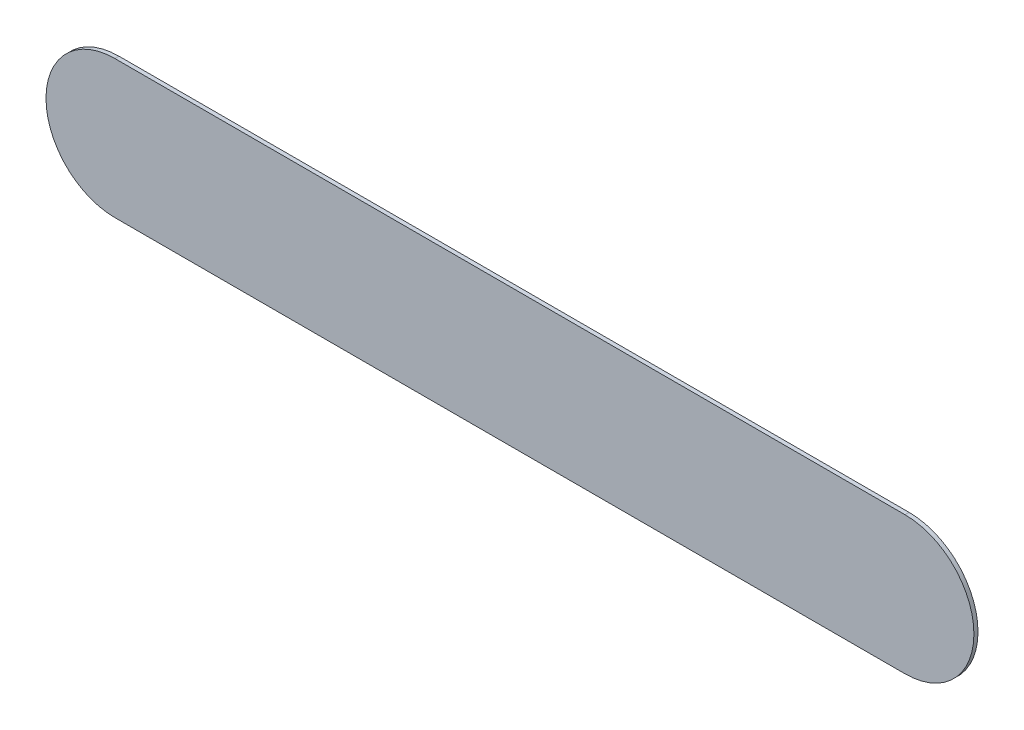
ISO-10303-21;
HEADER;
FILE_DESCRIPTION(('STEP AP214'),'2;1');
FILE_NAME('part.step','',(''),(''),'','','');
FILE_SCHEMA(('AUTOMOTIVE_DESIGN { 1 0 10303 214 1 1 1 1 }'));
ENDSEC;
DATA;
#1=APPLICATION_CONTEXT('core data for automotive mechanical design processes');
#2=APPLICATION_PROTOCOL_DEFINITION('international standard','automotive_design',2000,#1);
#3=PRODUCT_CONTEXT('',#1,'mechanical');
#4=PRODUCT('Part','Part','',(#3));
#5=PRODUCT_RELATED_PRODUCT_CATEGORY('part','',(#4));
#6=PRODUCT_DEFINITION_FORMATION('','',#4);
#7=PRODUCT_DEFINITION_CONTEXT('part definition',#1,'design');
#8=PRODUCT_DEFINITION('design','',#6,#7);
#9=PRODUCT_DEFINITION_SHAPE('','',#8);
#10=(LENGTH_UNIT() NAMED_UNIT(*) SI_UNIT(.MILLI.,.METRE.));
#11=(NAMED_UNIT(*) PLANE_ANGLE_UNIT() SI_UNIT($,.RADIAN.));
#12=(NAMED_UNIT(*) SI_UNIT($,.STERADIAN.) SOLID_ANGLE_UNIT());
#13=UNCERTAINTY_MEASURE_WITH_UNIT(LENGTH_MEASURE(1.E-05),#10,'distance_accuracy_value','');
#14=(GEOMETRIC_REPRESENTATION_CONTEXT(3) GLOBAL_UNCERTAINTY_ASSIGNED_CONTEXT((#13)) GLOBAL_UNIT_ASSIGNED_CONTEXT((#10,
#11,#12)) REPRESENTATION_CONTEXT('',''));
#15=CARTESIAN_POINT('',(0.,0.,0.));
#16=DIRECTION('',(0.,0.,1.));
#17=DIRECTION('',(1.,0.,0.));
#18=AXIS2_PLACEMENT_3D('',#15,#16,#17);
#19=CARTESIAN_POINT('',(107.5423808,46.5424012,0.));
#20=DIRECTION('',(0.,1.,0.));
#21=DIRECTION('',(1.,0.,0.));
#22=AXIS2_PLACEMENT_3D('',#19,#20,#21);
#23=PLANE('',#22);
#24=DIRECTION('',(1.,0.,0.));
#25=VECTOR('',#24,1.);
#26=CARTESIAN_POINT('',(107.5423808,46.5424012,0.03556));
#27=LINE('',#26,#25);
#28=CARTESIAN_POINT('',(107.5423808,46.5424012,0.03556));
#29=VERTEX_POINT('',#28);
#30=CARTESIAN_POINT('',(114.422428,46.5424012,0.03556));
#31=VERTEX_POINT('',#30);
#32=EDGE_CURVE('E11',#29,#31,#27,.T.);
#33=ORIENTED_EDGE('',*,*,#32,.F.);
#34=DIRECTION('',(0.,0.,1.));
#35=VECTOR('',#34,1.);
#36=CARTESIAN_POINT('',(107.5423808,46.5424012,0.));
#37=LINE('',#36,#35);
#38=CARTESIAN_POINT('',(107.5423808,46.5424012,0.));
#39=VERTEX_POINT('',#38);
#40=EDGE_CURVE('E24',#39,#29,#37,.T.);
#41=ORIENTED_EDGE('',*,*,#40,.F.);
#42=DIRECTION('',(1.,0.,0.));
#43=VECTOR('',#42,1.);
#44=CARTESIAN_POINT('',(107.5423808,46.5424012,0.));
#45=LINE('',#44,#43);
#46=CARTESIAN_POINT('',(114.422428,46.5424012,0.));
#47=VERTEX_POINT('',#46);
#48=EDGE_CURVE('E75',#39,#47,#45,.T.);
#49=ORIENTED_EDGE('',*,*,#48,.T.);
#50=DIRECTION('',(0.,0.,1.));
#51=VECTOR('',#50,1.);
#52=CARTESIAN_POINT('',(114.422428,46.5424012,0.));
#53=LINE('',#52,#51);
#54=EDGE_CURVE('E37',#47,#31,#53,.T.);
#55=ORIENTED_EDGE('',*,*,#54,.T.);
#56=EDGE_LOOP('',(#33,#41,#49,#55));
#57=FACE_BOUND('',#56,.T.);
#58=ADVANCED_FACE('F17',(#57),#23,.F.);
#59=CARTESIAN_POINT('',(114.422428,47.1424,0.));
#60=DIRECTION('',(0.,0.,-1.));
#61=DIRECTION('',(0.,-1.,0.));
#62=AXIS2_PLACEMENT_3D('',#59,#60,#61);
#63=CYLINDRICAL_SURFACE('',#62,0.599998800000002);
#64=CARTESIAN_POINT('',(114.422428,47.1424,0.03556));
#65=DIRECTION('',(0.,0.,1.));
#66=DIRECTION('',(0.,-1.,0.));
#67=AXIS2_PLACEMENT_3D('',#64,#65,#66);
#68=CIRCLE('',#67,0.599998800000002);
#69=CARTESIAN_POINT('',(114.422428,47.7423988,0.03556));
#70=VERTEX_POINT('',#69);
#71=EDGE_CURVE('E83',#31,#70,#68,.T.);
#72=ORIENTED_EDGE('',*,*,#71,.F.);
#73=ORIENTED_EDGE('',*,*,#54,.F.);
#74=CARTESIAN_POINT('',(114.422428,47.1424,0.));
#75=DIRECTION('',(0.,0.,1.));
#76=DIRECTION('',(0.,-1.,0.));
#77=AXIS2_PLACEMENT_3D('',#74,#75,#76);
#78=CIRCLE('',#77,0.599998800000002);
#79=CARTESIAN_POINT('',(114.422428,47.7423988,0.));
#80=VERTEX_POINT('',#79);
#81=EDGE_CURVE('E81',#47,#80,#78,.T.);
#82=ORIENTED_EDGE('',*,*,#81,.T.);
#83=DIRECTION('',(0.,0.,1.));
#84=VECTOR('',#83,1.);
#85=CARTESIAN_POINT('',(114.422428,47.7423988,0.));
#86=LINE('',#85,#84);
#87=EDGE_CURVE('E67',#80,#70,#86,.T.);
#88=ORIENTED_EDGE('',*,*,#87,.T.);
#89=EDGE_LOOP('',(#72,#73,#82,#88));
#90=FACE_BOUND('',#89,.T.);
#91=ADVANCED_FACE('F89',(#90),#63,.T.);
#92=CARTESIAN_POINT('',(114.422428,47.7423988,0.));
#93=DIRECTION('',(0.,-1.,0.));
#94=DIRECTION('',(-1.,0.,0.));
#95=AXIS2_PLACEMENT_3D('',#92,#93,#94);
#96=PLANE('',#95);
#97=DIRECTION('',(-1.,0.,0.));
#98=VECTOR('',#97,1.);
#99=CARTESIAN_POINT('',(114.422428,47.7423988,0.03556));
#100=LINE('',#99,#98);
#101=CARTESIAN_POINT('',(107.5423808,47.7423988,0.03556));
#102=VERTEX_POINT('',#101);
#103=EDGE_CURVE('E71',#70,#102,#100,.T.);
#104=ORIENTED_EDGE('',*,*,#103,.F.);
#105=ORIENTED_EDGE('',*,*,#87,.F.);
#106=DIRECTION('',(-1.,0.,0.));
#107=VECTOR('',#106,1.);
#108=CARTESIAN_POINT('',(114.422428,47.7423988,0.));
#109=LINE('',#108,#107);
#110=CARTESIAN_POINT('',(107.5423808,47.7423988,0.));
#111=VERTEX_POINT('',#110);
#112=EDGE_CURVE('E63',#80,#111,#109,.T.);
#113=ORIENTED_EDGE('',*,*,#112,.T.);
#114=DIRECTION('',(0.,0.,1.));
#115=VECTOR('',#114,1.);
#116=CARTESIAN_POINT('',(107.5423808,47.7423988,0.));
#117=LINE('',#116,#115);
#118=EDGE_CURVE('E53',#111,#102,#117,.T.);
#119=ORIENTED_EDGE('',*,*,#118,.T.);
#120=EDGE_LOOP('',(#104,#105,#113,#119));
#121=FACE_BOUND('',#120,.T.);
#122=ADVANCED_FACE('F66',(#121),#96,.F.);
#123=CARTESIAN_POINT('',(107.5423808,47.1424,0.));
#124=DIRECTION('',(0.,0.,-1.));
#125=DIRECTION('',(0.,1.,0.));
#126=AXIS2_PLACEMENT_3D('',#123,#124,#125);
#127=CYLINDRICAL_SURFACE('',#126,0.599998799999997);
#128=CARTESIAN_POINT('',(107.5423808,47.1424,0.03556));
#129=DIRECTION('',(0.,0.,1.));
#130=DIRECTION('',(0.,1.,0.));
#131=AXIS2_PLACEMENT_3D('',#128,#129,#130);
#132=CIRCLE('',#131,0.599998799999997);
#133=EDGE_CURVE('E59',#102,#29,#132,.T.);
#134=ORIENTED_EDGE('',*,*,#133,.F.);
#135=ORIENTED_EDGE('',*,*,#118,.F.);
#136=CARTESIAN_POINT('',(107.5423808,47.1424,0.));
#137=DIRECTION('',(0.,0.,1.));
#138=DIRECTION('',(0.,1.,0.));
#139=AXIS2_PLACEMENT_3D('',#136,#137,#138);
#140=CIRCLE('',#139,0.599998799999997);
#141=EDGE_CURVE('E57',#111,#39,#140,.T.);
#142=ORIENTED_EDGE('',*,*,#141,.T.);
#143=ORIENTED_EDGE('',*,*,#40,.T.);
#144=EDGE_LOOP('',(#134,#135,#142,#143));
#145=FACE_BOUND('',#144,.T.);
#146=ADVANCED_FACE('F55',(#145),#127,.T.);
#147=CARTESIAN_POINT('',(107.5423808,46.5424012,0.));
#148=DIRECTION('',(0.,0.,-1.));
#149=DIRECTION('',(-1.,0.,0.));
#150=AXIS2_PLACEMENT_3D('',#147,#148,#149);
#151=PLANE('',#150);
#152=ORIENTED_EDGE('',*,*,#141,.F.);
#153=ORIENTED_EDGE('',*,*,#112,.F.);
#154=ORIENTED_EDGE('',*,*,#81,.F.);
#155=ORIENTED_EDGE('',*,*,#48,.F.);
#156=EDGE_LOOP('',(#152,#153,#154,#155));
#157=FACE_BOUND('',#156,.T.);
#158=ADVANCED_FACE('F74',(#157),#151,.T.);
#159=CARTESIAN_POINT('',(107.5423808,46.5424012,0.03556));
#160=DIRECTION('',(0.,0.,-1.));
#161=DIRECTION('',(-1.,0.,0.));
#162=AXIS2_PLACEMENT_3D('',#159,#160,#161);
#163=PLANE('',#162);
#164=ORIENTED_EDGE('',*,*,#32,.T.);
#165=ORIENTED_EDGE('',*,*,#71,.T.);
#166=ORIENTED_EDGE('',*,*,#103,.T.);
#167=ORIENTED_EDGE('',*,*,#133,.T.);
#168=EDGE_LOOP('',(#164,#165,#166,#167));
#169=FACE_BOUND('',#168,.T.);
#170=ADVANCED_FACE('F91',(#169),#163,.F.);
#171=CLOSED_SHELL('',(#58,#91,#122,#146,#158,#170));
#172=MANIFOLD_SOLID_BREP('B1',#171);
#173=ADVANCED_BREP_SHAPE_REPRESENTATION('',(#18,#172),#14);
#174=SHAPE_DEFINITION_REPRESENTATION(#9,#173);
ENDSEC;
END-ISO-10303-21;
